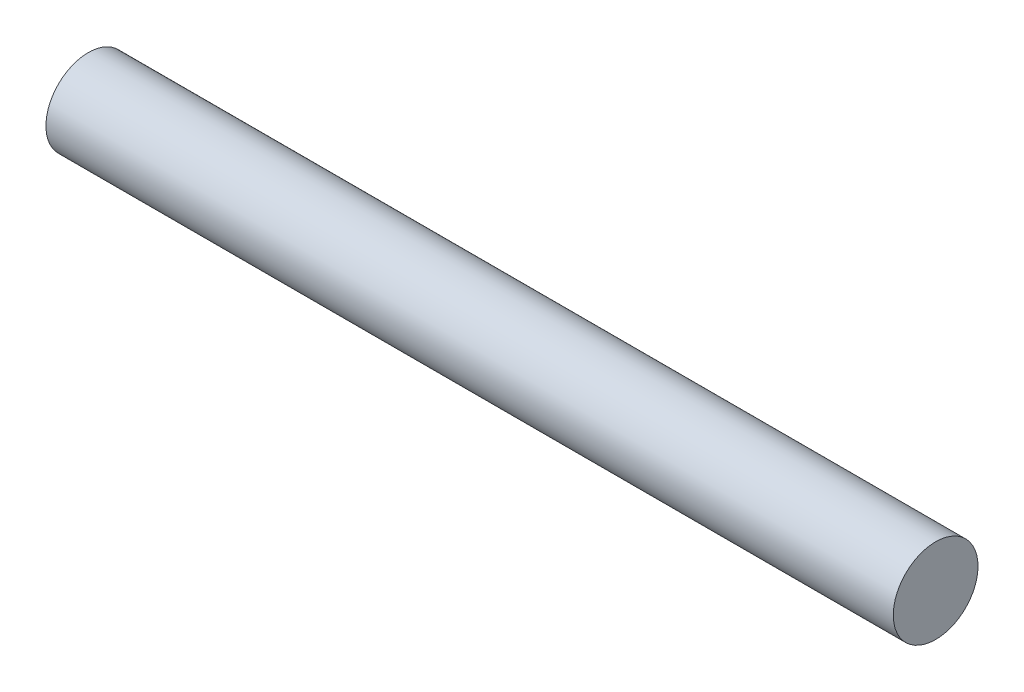
ISO-10303-21;
HEADER;
FILE_DESCRIPTION(('STEP AP214'),'2;1');
FILE_NAME('part.step','',(''),(''),'','','');
FILE_SCHEMA(('AUTOMOTIVE_DESIGN { 1 0 10303 214 1 1 1 1 }'));
ENDSEC;
DATA;
#1=APPLICATION_CONTEXT('core data for automotive mechanical design processes');
#2=APPLICATION_PROTOCOL_DEFINITION('international standard','automotive_design',2000,#1);
#3=PRODUCT_CONTEXT('',#1,'mechanical');
#4=PRODUCT('Part','Part','',(#3));
#5=PRODUCT_RELATED_PRODUCT_CATEGORY('part','',(#4));
#6=PRODUCT_DEFINITION_FORMATION('','',#4);
#7=PRODUCT_DEFINITION_CONTEXT('part definition',#1,'design');
#8=PRODUCT_DEFINITION('design','',#6,#7);
#9=PRODUCT_DEFINITION_SHAPE('','',#8);
#10=(LENGTH_UNIT() NAMED_UNIT(*) SI_UNIT(.MILLI.,.METRE.));
#11=(NAMED_UNIT(*) PLANE_ANGLE_UNIT() SI_UNIT($,.RADIAN.));
#12=(NAMED_UNIT(*) SI_UNIT($,.STERADIAN.) SOLID_ANGLE_UNIT());
#13=UNCERTAINTY_MEASURE_WITH_UNIT(LENGTH_MEASURE(1.E-05),#10,'distance_accuracy_value','');
#14=(GEOMETRIC_REPRESENTATION_CONTEXT(3) GLOBAL_UNCERTAINTY_ASSIGNED_CONTEXT((#13)) GLOBAL_UNIT_ASSIGNED_CONTEXT((#10,
#11,#12)) REPRESENTATION_CONTEXT('',''));
#15=CARTESIAN_POINT('',(0.,0.,0.));
#16=DIRECTION('',(0.,0.,1.));
#17=DIRECTION('',(1.,0.,0.));
#18=AXIS2_PLACEMENT_3D('',#15,#16,#17);
#19=CARTESIAN_POINT('',(127.,0.,0.));
#20=DIRECTION('',(-1.,0.,0.));
#21=DIRECTION('',(0.,0.,1.));
#22=AXIS2_PLACEMENT_3D('',#19,#20,#21);
#23=CYLINDRICAL_SURFACE('',#22,6.35);
#24=CARTESIAN_POINT('',(127.,0.,0.));
#25=DIRECTION('',(1.,0.,0.));
#26=DIRECTION('',(0.,0.,-1.));
#27=AXIS2_PLACEMENT_3D('',#24,#25,#26);
#28=CIRCLE('',#27,6.35);
#29=CARTESIAN_POINT('',(127.,0.,-6.35));
#30=VERTEX_POINT('',#29);
#31=EDGE_CURVE('E10',#30,#30,#28,.T.);
#32=ORIENTED_EDGE('',*,*,#31,.F.);
#33=EDGE_LOOP('',(#32));
#34=FACE_BOUND('',#33,.T.);
#35=CARTESIAN_POINT('',(0.,0.,0.));
#36=DIRECTION('',(1.,0.,0.));
#37=DIRECTION('',(0.,0.,-1.));
#38=AXIS2_PLACEMENT_3D('',#35,#36,#37);
#39=CIRCLE('',#38,6.35);
#40=CARTESIAN_POINT('',(0.,0.,-6.35));
#41=VERTEX_POINT('',#40);
#42=EDGE_CURVE('E42',#41,#41,#39,.T.);
#43=ORIENTED_EDGE('',*,*,#42,.T.);
#44=EDGE_LOOP('',(#43));
#45=FACE_BOUND('',#44,.T.);
#46=ADVANCED_FACE('F39',(#34,#45),#23,.T.);
#47=CARTESIAN_POINT('',(127.,0.,0.));
#48=DIRECTION('',(1.,0.,0.));
#49=DIRECTION('',(0.,0.,-1.));
#50=AXIS2_PLACEMENT_3D('',#47,#48,#49);
#51=PLANE('',#50);
#52=ORIENTED_EDGE('',*,*,#31,.T.);
#53=EDGE_LOOP('',(#52));
#54=FACE_BOUND('',#53,.T.);
#55=ADVANCED_FACE('F54',(#54),#51,.T.);
#56=CARTESIAN_POINT('',(0.,0.,0.));
#57=DIRECTION('',(1.,0.,0.));
#58=DIRECTION('',(0.,0.,-1.));
#59=AXIS2_PLACEMENT_3D('',#56,#57,#58);
#60=PLANE('',#59);
#61=ORIENTED_EDGE('',*,*,#42,.F.);
#62=EDGE_LOOP('',(#61));
#63=FACE_BOUND('',#62,.T.);
#64=ADVANCED_FACE('F52',(#63),#60,.F.);
#65=CLOSED_SHELL('',(#46,#55,#64));
#66=MANIFOLD_SOLID_BREP('B2',#65);
#67=ADVANCED_BREP_SHAPE_REPRESENTATION('',(#18,#66),#14);
#68=SHAPE_DEFINITION_REPRESENTATION(#9,#67);
ENDSEC;
END-ISO-10303-21;
